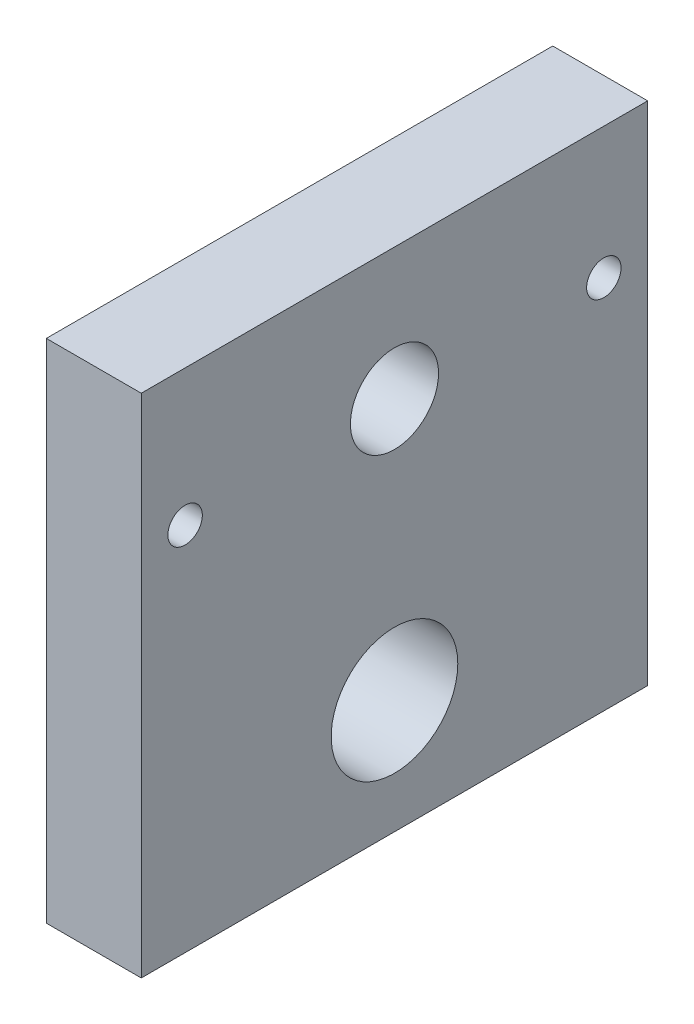
ISO-10303-21;
HEADER;
FILE_DESCRIPTION(('STEP AP214'),'2;1');
FILE_NAME('part.step','',(''),(''),'','','');
FILE_SCHEMA(('AUTOMOTIVE_DESIGN { 1 0 10303 214 1 1 1 1 }'));
ENDSEC;
DATA;
#1=APPLICATION_CONTEXT('core data for automotive mechanical design processes');
#2=APPLICATION_PROTOCOL_DEFINITION('international standard','automotive_design',2000,#1);
#3=PRODUCT_CONTEXT('',#1,'mechanical');
#4=PRODUCT('Part','Part','',(#3));
#5=PRODUCT_RELATED_PRODUCT_CATEGORY('part','',(#4));
#6=PRODUCT_DEFINITION_FORMATION('','',#4);
#7=PRODUCT_DEFINITION_CONTEXT('part definition',#1,'design');
#8=PRODUCT_DEFINITION('design','',#6,#7);
#9=PRODUCT_DEFINITION_SHAPE('','',#8);
#10=(LENGTH_UNIT() NAMED_UNIT(*) SI_UNIT(.MILLI.,.METRE.));
#11=(NAMED_UNIT(*) PLANE_ANGLE_UNIT() SI_UNIT($,.RADIAN.));
#12=(NAMED_UNIT(*) SI_UNIT($,.STERADIAN.) SOLID_ANGLE_UNIT());
#13=UNCERTAINTY_MEASURE_WITH_UNIT(LENGTH_MEASURE(1.E-05),#10,'distance_accuracy_value','');
#14=(GEOMETRIC_REPRESENTATION_CONTEXT(3) GLOBAL_UNCERTAINTY_ASSIGNED_CONTEXT((#13)) GLOBAL_UNIT_ASSIGNED_CONTEXT((#10,
#11,#12)) REPRESENTATION_CONTEXT('',''));
#15=CARTESIAN_POINT('',(0.,0.,0.));
#16=DIRECTION('',(0.,0.,1.));
#17=DIRECTION('',(1.,0.,0.));
#18=AXIS2_PLACEMENT_3D('',#15,#16,#17);
#19=CARTESIAN_POINT('',(9.525,-25.4,-25.4));
#20=DIRECTION('',(0.,0.,1.));
#21=DIRECTION('',(1.,0.,0.));
#22=AXIS2_PLACEMENT_3D('',#19,#20,#21);
#23=PLANE('',#22);
#24=CARTESIAN_POINT('',(4.7625,-19.05,-25.4));
#25=DIRECTION('',(0.,0.,-1.));
#26=DIRECTION('',(-1.,0.,0.));
#27=AXIS2_PLACEMENT_3D('',#24,#25,#26);
#28=CIRCLE('',#27,2.0193);
#29=CARTESIAN_POINT('',(2.7432,-19.05,-25.4));
#30=VERTEX_POINT('',#29);
#31=EDGE_CURVE('E103',#30,#30,#28,.T.);
#32=ORIENTED_EDGE('',*,*,#31,.F.);
#33=EDGE_LOOP('',(#32));
#34=FACE_BOUND('',#33,.T.);
#35=CARTESIAN_POINT('',(4.7625,19.05,-25.4));
#36=DIRECTION('',(0.,0.,-1.));
#37=DIRECTION('',(-1.,0.,0.));
#38=AXIS2_PLACEMENT_3D('',#35,#36,#37);
#39=CIRCLE('',#38,2.0193);
#40=CARTESIAN_POINT('',(2.7432,19.05,-25.4));
#41=VERTEX_POINT('',#40);
#42=EDGE_CURVE('E102',#41,#41,#39,.T.);
#43=ORIENTED_EDGE('',*,*,#42,.F.);
#44=EDGE_LOOP('',(#43));
#45=FACE_BOUND('',#44,.T.);
#46=DIRECTION('',(0.,1.,0.));
#47=VECTOR('',#46,1.);
#48=CARTESIAN_POINT('',(0.,-25.4,-25.4));
#49=LINE('',#48,#47);
#50=CARTESIAN_POINT('',(0.,-25.4,-25.4));
#51=VERTEX_POINT('',#50);
#52=CARTESIAN_POINT('',(0.,25.4,-25.4));
#53=VERTEX_POINT('',#52);
#54=EDGE_CURVE('E134',#51,#53,#49,.T.);
#55=ORIENTED_EDGE('',*,*,#54,.T.);
#56=DIRECTION('',(-1.,0.,0.));
#57=VECTOR('',#56,1.);
#58=CARTESIAN_POINT('',(9.525,25.4,-25.4));
#59=LINE('',#58,#57);
#60=CARTESIAN_POINT('',(9.525,25.4,-25.4));
#61=VERTEX_POINT('',#60);
#62=EDGE_CURVE('E11',#61,#53,#59,.T.);
#63=ORIENTED_EDGE('',*,*,#62,.F.);
#64=DIRECTION('',(0.,1.,0.));
#65=VECTOR('',#64,1.);
#66=CARTESIAN_POINT('',(9.525,-25.4,-25.4));
#67=LINE('',#66,#65);
#68=CARTESIAN_POINT('',(9.525,-25.4,-25.4));
#69=VERTEX_POINT('',#68);
#70=EDGE_CURVE('E135',#69,#61,#67,.T.);
#71=ORIENTED_EDGE('',*,*,#70,.F.);
#72=DIRECTION('',(-1.,0.,0.));
#73=VECTOR('',#72,1.);
#74=CARTESIAN_POINT('',(9.525,-25.4,-25.4));
#75=LINE('',#74,#73);
#76=EDGE_CURVE('E141',#69,#51,#75,.T.);
#77=ORIENTED_EDGE('',*,*,#76,.T.);
#78=EDGE_LOOP('',(#55,#63,#71,#77));
#79=FACE_BOUND('',#78,.T.);
#80=ADVANCED_FACE('F37',(#34,#45,#79),#23,.F.);
#81=CARTESIAN_POINT('',(9.525,25.4,25.4));
#82=DIRECTION('',(0.,-1.,0.));
#83=DIRECTION('',(0.,0.,-1.));
#84=AXIS2_PLACEMENT_3D('',#81,#82,#83);
#85=PLANE('',#84);
#86=DIRECTION('',(0.,0.,1.));
#87=VECTOR('',#86,1.);
#88=CARTESIAN_POINT('',(0.,25.4,25.4));
#89=LINE('',#88,#87);
#90=CARTESIAN_POINT('',(0.,25.4,25.4));
#91=VERTEX_POINT('',#90);
#92=EDGE_CURVE('E144',#53,#91,#89,.T.);
#93=ORIENTED_EDGE('',*,*,#92,.T.);
#94=DIRECTION('',(-1.,0.,0.));
#95=VECTOR('',#94,1.);
#96=CARTESIAN_POINT('',(9.525,25.4,25.4));
#97=LINE('',#96,#95);
#98=CARTESIAN_POINT('',(9.525,25.4,25.4));
#99=VERTEX_POINT('',#98);
#100=EDGE_CURVE('E46',#99,#91,#97,.T.);
#101=ORIENTED_EDGE('',*,*,#100,.F.);
#102=DIRECTION('',(0.,0.,1.));
#103=VECTOR('',#102,1.);
#104=CARTESIAN_POINT('',(9.525,25.4,25.4));
#105=LINE('',#104,#103);
#106=EDGE_CURVE('E85',#61,#99,#105,.T.);
#107=ORIENTED_EDGE('',*,*,#106,.F.);
#108=ORIENTED_EDGE('',*,*,#62,.T.);
#109=EDGE_LOOP('',(#93,#101,#107,#108));
#110=FACE_BOUND('',#109,.T.);
#111=ADVANCED_FACE('F169',(#110),#85,.F.);
#112=CARTESIAN_POINT('',(9.525,-25.4,25.4));
#113=DIRECTION('',(0.,0.,-1.));
#114=DIRECTION('',(-1.,0.,0.));
#115=AXIS2_PLACEMENT_3D('',#112,#113,#114);
#116=PLANE('',#115);
#117=DIRECTION('',(0.,-1.,0.));
#118=VECTOR('',#117,1.);
#119=CARTESIAN_POINT('',(0.,-25.4,25.4));
#120=LINE('',#119,#118);
#121=CARTESIAN_POINT('',(0.,-25.4,25.4));
#122=VERTEX_POINT('',#121);
#123=EDGE_CURVE('E72',#91,#122,#120,.T.);
#124=ORIENTED_EDGE('',*,*,#123,.T.);
#125=DIRECTION('',(-1.,0.,0.));
#126=VECTOR('',#125,1.);
#127=CARTESIAN_POINT('',(9.525,-25.4,25.4));
#128=LINE('',#127,#126);
#129=CARTESIAN_POINT('',(9.525,-25.4,25.4));
#130=VERTEX_POINT('',#129);
#131=EDGE_CURVE('E149',#130,#122,#128,.T.);
#132=ORIENTED_EDGE('',*,*,#131,.F.);
#133=DIRECTION('',(0.,-1.,0.));
#134=VECTOR('',#133,1.);
#135=CARTESIAN_POINT('',(9.525,-25.4,25.4));
#136=LINE('',#135,#134);
#137=EDGE_CURVE('E138',#99,#130,#136,.T.);
#138=ORIENTED_EDGE('',*,*,#137,.F.);
#139=ORIENTED_EDGE('',*,*,#100,.T.);
#140=EDGE_LOOP('',(#124,#132,#138,#139));
#141=FACE_BOUND('',#140,.T.);
#142=ADVANCED_FACE('F152',(#141),#116,.F.);
#143=CARTESIAN_POINT('',(9.525,-25.4,25.4));
#144=DIRECTION('',(0.,1.,0.));
#145=DIRECTION('',(0.,0.,1.));
#146=AXIS2_PLACEMENT_3D('',#143,#144,#145);
#147=PLANE('',#146);
#148=DIRECTION('',(0.,0.,-1.));
#149=VECTOR('',#148,1.);
#150=CARTESIAN_POINT('',(0.,-25.4,25.4));
#151=LINE('',#150,#149);
#152=EDGE_CURVE('E78',#122,#51,#151,.T.);
#153=ORIENTED_EDGE('',*,*,#152,.T.);
#154=ORIENTED_EDGE('',*,*,#76,.F.);
#155=DIRECTION('',(0.,0.,-1.));
#156=VECTOR('',#155,1.);
#157=CARTESIAN_POINT('',(9.525,-25.4,25.4));
#158=LINE('',#157,#156);
#159=EDGE_CURVE('E54',#130,#69,#158,.T.);
#160=ORIENTED_EDGE('',*,*,#159,.F.);
#161=ORIENTED_EDGE('',*,*,#131,.T.);
#162=EDGE_LOOP('',(#153,#154,#160,#161));
#163=FACE_BOUND('',#162,.T.);
#164=ADVANCED_FACE('F159',(#163),#147,.F.);
#165=CARTESIAN_POINT('',(9.525,0.,0.));
#166=DIRECTION('',(-1.,0.,0.));
#167=DIRECTION('',(0.,0.,1.));
#168=AXIS2_PLACEMENT_3D('',#165,#166,#167);
#169=PLANE('',#168);
#170=CARTESIAN_POINT('',(9.525,12.2301,-21.));
#171=DIRECTION('',(1.,0.,0.));
#172=DIRECTION('',(0.,0.,-1.));
#173=AXIS2_PLACEMENT_3D('',#170,#171,#172);
#174=CIRCLE('',#173,1.72719999999999);
#175=CARTESIAN_POINT('',(9.525,12.2301,-22.7272));
#176=VERTEX_POINT('',#175);
#177=EDGE_CURVE('E113',#176,#176,#174,.T.);
#178=ORIENTED_EDGE('',*,*,#177,.F.);
#179=EDGE_LOOP('',(#178));
#180=FACE_BOUND('',#179,.T.);
#181=CARTESIAN_POINT('',(9.525,11.7414591500542,21.));
#182=DIRECTION('',(1.,0.,0.));
#183=DIRECTION('',(0.,0.,-1.));
#184=AXIS2_PLACEMENT_3D('',#181,#182,#183);
#185=CIRCLE('',#184,1.72719999999999);
#186=CARTESIAN_POINT('',(9.525,11.7414591500542,19.2728));
#187=VERTEX_POINT('',#186);
#188=EDGE_CURVE('E116',#187,#187,#185,.T.);
#189=ORIENTED_EDGE('',*,*,#188,.F.);
#190=EDGE_LOOP('',(#189));
#191=FACE_BOUND('',#190,.T.);
#192=CARTESIAN_POINT('',(9.525,12.2301,0.));
#193=DIRECTION('',(1.,0.,0.));
#194=DIRECTION('',(0.,0.,-1.));
#195=AXIS2_PLACEMENT_3D('',#192,#193,#194);
#196=CIRCLE('',#195,4.41959999999999);
#197=CARTESIAN_POINT('',(9.525,12.2301,-4.41959999999999));
#198=VERTEX_POINT('',#197);
#199=EDGE_CURVE('E122',#198,#198,#196,.T.);
#200=ORIENTED_EDGE('',*,*,#199,.F.);
#201=EDGE_LOOP('',(#200));
#202=FACE_BOUND('',#201,.T.);
#203=CARTESIAN_POINT('',(9.525,-13.97,0.));
#204=DIRECTION('',(1.,0.,0.));
#205=DIRECTION('',(0.,0.,-1.));
#206=AXIS2_PLACEMENT_3D('',#203,#204,#205);
#207=CIRCLE('',#206,6.34999999999999);
#208=CARTESIAN_POINT('',(9.525,-13.97,-6.34999999999999));
#209=VERTEX_POINT('',#208);
#210=EDGE_CURVE('E128',#209,#209,#207,.T.);
#211=ORIENTED_EDGE('',*,*,#210,.F.);
#212=EDGE_LOOP('',(#211));
#213=FACE_BOUND('',#212,.T.);
#214=ORIENTED_EDGE('',*,*,#70,.T.);
#215=ORIENTED_EDGE('',*,*,#106,.T.);
#216=ORIENTED_EDGE('',*,*,#137,.T.);
#217=ORIENTED_EDGE('',*,*,#159,.T.);
#218=EDGE_LOOP('',(#214,#215,#216,#217));
#219=FACE_BOUND('',#218,.T.);
#220=ADVANCED_FACE('F161',(#180,#191,#202,#213,#219),#169,.F.);
#221=CARTESIAN_POINT('',(0.,0.,0.));
#222=DIRECTION('',(-1.,0.,0.));
#223=DIRECTION('',(0.,0.,1.));
#224=AXIS2_PLACEMENT_3D('',#221,#222,#223);
#225=PLANE('',#224);
#226=CARTESIAN_POINT('',(0.,12.2301,-21.));
#227=DIRECTION('',(-1.,0.,0.));
#228=DIRECTION('',(0.,0.,1.));
#229=AXIS2_PLACEMENT_3D('',#226,#227,#228);
#230=CIRCLE('',#229,1.72719999999999);
#231=CARTESIAN_POINT('',(0.,12.2301,-19.2728));
#232=VERTEX_POINT('',#231);
#233=EDGE_CURVE('E40',#232,#232,#230,.T.);
#234=ORIENTED_EDGE('',*,*,#233,.F.);
#235=EDGE_LOOP('',(#234));
#236=FACE_BOUND('',#235,.T.);
#237=CARTESIAN_POINT('',(0.,11.7414591500542,21.));
#238=DIRECTION('',(-1.,0.,0.));
#239=DIRECTION('',(0.,0.,1.));
#240=AXIS2_PLACEMENT_3D('',#237,#238,#239);
#241=CIRCLE('',#240,1.72719999999999);
#242=CARTESIAN_POINT('',(0.,11.7414591500542,22.7272));
#243=VERTEX_POINT('',#242);
#244=EDGE_CURVE('E119',#243,#243,#241,.T.);
#245=ORIENTED_EDGE('',*,*,#244,.F.);
#246=EDGE_LOOP('',(#245));
#247=FACE_BOUND('',#246,.T.);
#248=CARTESIAN_POINT('',(0.,12.2301,0.));
#249=DIRECTION('',(-1.,0.,0.));
#250=DIRECTION('',(0.,0.,1.));
#251=AXIS2_PLACEMENT_3D('',#248,#249,#250);
#252=CIRCLE('',#251,4.41959999999999);
#253=CARTESIAN_POINT('',(0.,12.2301,4.41959999999999));
#254=VERTEX_POINT('',#253);
#255=EDGE_CURVE('E125',#254,#254,#252,.T.);
#256=ORIENTED_EDGE('',*,*,#255,.F.);
#257=EDGE_LOOP('',(#256));
#258=FACE_BOUND('',#257,.T.);
#259=CARTESIAN_POINT('',(0.,-13.97,0.));
#260=DIRECTION('',(-1.,0.,0.));
#261=DIRECTION('',(0.,0.,1.));
#262=AXIS2_PLACEMENT_3D('',#259,#260,#261);
#263=CIRCLE('',#262,6.34999999999999);
#264=CARTESIAN_POINT('',(0.,-13.97,6.34999999999998));
#265=VERTEX_POINT('',#264);
#266=EDGE_CURVE('E131',#265,#265,#263,.T.);
#267=ORIENTED_EDGE('',*,*,#266,.F.);
#268=EDGE_LOOP('',(#267));
#269=FACE_BOUND('',#268,.T.);
#270=ORIENTED_EDGE('',*,*,#54,.F.);
#271=ORIENTED_EDGE('',*,*,#152,.F.);
#272=ORIENTED_EDGE('',*,*,#123,.F.);
#273=ORIENTED_EDGE('',*,*,#92,.F.);
#274=EDGE_LOOP('',(#270,#271,#272,#273));
#275=FACE_BOUND('',#274,.T.);
#276=ADVANCED_FACE('F155',(#236,#247,#258,#269,#275),#225,.T.);
#277=CARTESIAN_POINT('',(9.525,-13.97,0.));
#278=DIRECTION('',(1.,0.,0.));
#279=DIRECTION('',(0.,0.,-1.));
#280=AXIS2_PLACEMENT_3D('',#277,#278,#279);
#281=CYLINDRICAL_SURFACE('',#280,6.34999999999999);
#282=ORIENTED_EDGE('',*,*,#266,.T.);
#283=EDGE_LOOP('',(#282));
#284=FACE_BOUND('',#283,.T.);
#285=ORIENTED_EDGE('',*,*,#210,.T.);
#286=EDGE_LOOP('',(#285));
#287=FACE_BOUND('',#286,.T.);
#288=ADVANCED_FACE('F204',(#284,#287),#281,.F.);
#289=CARTESIAN_POINT('',(9.525,12.2301,0.));
#290=DIRECTION('',(1.,0.,0.));
#291=DIRECTION('',(0.,0.,-1.));
#292=AXIS2_PLACEMENT_3D('',#289,#290,#291);
#293=CYLINDRICAL_SURFACE('',#292,4.41959999999999);
#294=ORIENTED_EDGE('',*,*,#255,.T.);
#295=EDGE_LOOP('',(#294));
#296=FACE_BOUND('',#295,.T.);
#297=ORIENTED_EDGE('',*,*,#199,.T.);
#298=EDGE_LOOP('',(#297));
#299=FACE_BOUND('',#298,.T.);
#300=ADVANCED_FACE('F200',(#296,#299),#293,.F.);
#301=CARTESIAN_POINT('',(9.525,11.7414591500542,21.));
#302=DIRECTION('',(1.,0.,0.));
#303=DIRECTION('',(0.,0.,-1.));
#304=AXIS2_PLACEMENT_3D('',#301,#302,#303);
#305=CYLINDRICAL_SURFACE('',#304,1.72719999999999);
#306=ORIENTED_EDGE('',*,*,#244,.T.);
#307=EDGE_LOOP('',(#306));
#308=FACE_BOUND('',#307,.T.);
#309=ORIENTED_EDGE('',*,*,#188,.T.);
#310=EDGE_LOOP('',(#309));
#311=FACE_BOUND('',#310,.T.);
#312=ADVANCED_FACE('F196',(#308,#311),#305,.F.);
#313=CARTESIAN_POINT('',(9.525,12.2301,-21.));
#314=DIRECTION('',(1.,0.,0.));
#315=DIRECTION('',(0.,0.,-1.));
#316=AXIS2_PLACEMENT_3D('',#313,#314,#315);
#317=CYLINDRICAL_SURFACE('',#316,1.72719999999999);
#318=ORIENTED_EDGE('',*,*,#233,.T.);
#319=EDGE_LOOP('',(#318));
#320=FACE_BOUND('',#319,.T.);
#321=ORIENTED_EDGE('',*,*,#177,.T.);
#322=EDGE_LOOP('',(#321));
#323=FACE_BOUND('',#322,.T.);
#324=ADVANCED_FACE('F188',(#320,#323),#317,.F.);
#325=CARTESIAN_POINT('',(4.7625,19.05,-13.462));
#326=DIRECTION('',(0.,0.,-1.));
#327=DIRECTION('',(-1.,0.,0.));
#328=AXIS2_PLACEMENT_3D('',#325,#326,#327);
#329=CONICAL_SURFACE('',#328,2.0193,1.02974425867665);
#330=CARTESIAN_POINT('',(4.7625,19.05,-12.2486821519976));
#331=VERTEX_POINT('',#330);
#332=VERTEX_LOOP('',#331);
#333=FACE_BOUND('',#332,.T.);
#334=CARTESIAN_POINT('',(4.7625,19.05,-13.462));
#335=DIRECTION('',(0.,0.,-1.));
#336=DIRECTION('',(-1.,0.,0.));
#337=AXIS2_PLACEMENT_3D('',#334,#335,#336);
#338=CIRCLE('',#337,2.0193);
#339=CARTESIAN_POINT('',(2.74320000000001,19.05,-13.462));
#340=VERTEX_POINT('',#339);
#341=EDGE_CURVE('E106',#340,#340,#338,.T.);
#342=ORIENTED_EDGE('',*,*,#341,.T.);
#343=EDGE_LOOP('',(#342));
#344=FACE_BOUND('',#343,.T.);
#345=ADVANCED_FACE('F182',(#333,#344),#329,.F.);
#346=CARTESIAN_POINT('',(4.7625,19.05,-25.4));
#347=DIRECTION('',(0.,0.,-1.));
#348=DIRECTION('',(-1.,0.,0.));
#349=AXIS2_PLACEMENT_3D('',#346,#347,#348);
#350=CYLINDRICAL_SURFACE('',#349,2.0193);
#351=ORIENTED_EDGE('',*,*,#341,.F.);
#352=EDGE_LOOP('',(#351));
#353=FACE_BOUND('',#352,.T.);
#354=ORIENTED_EDGE('',*,*,#42,.T.);
#355=EDGE_LOOP('',(#354));
#356=FACE_BOUND('',#355,.T.);
#357=ADVANCED_FACE('F96',(#353,#356),#350,.F.);
#358=CARTESIAN_POINT('',(4.7625,-19.05,-13.462));
#359=DIRECTION('',(0.,0.,-1.));
#360=DIRECTION('',(-1.,0.,0.));
#361=AXIS2_PLACEMENT_3D('',#358,#359,#360);
#362=CONICAL_SURFACE('',#361,2.0193,1.02974425867665);
#363=CARTESIAN_POINT('',(4.7625,-19.05,-12.2486821519976));
#364=VERTEX_POINT('',#363);
#365=VERTEX_LOOP('',#364);
#366=FACE_BOUND('',#365,.T.);
#367=CARTESIAN_POINT('',(4.7625,-19.05,-13.462));
#368=DIRECTION('',(0.,0.,-1.));
#369=DIRECTION('',(-1.,0.,0.));
#370=AXIS2_PLACEMENT_3D('',#367,#368,#369);
#371=CIRCLE('',#370,2.0193);
#372=CARTESIAN_POINT('',(2.74320000000001,-19.05,-13.462));
#373=VERTEX_POINT('',#372);
#374=EDGE_CURVE('E100',#373,#373,#371,.T.);
#375=ORIENTED_EDGE('',*,*,#374,.T.);
#376=EDGE_LOOP('',(#375));
#377=FACE_BOUND('',#376,.T.);
#378=ADVANCED_FACE('F92',(#366,#377),#362,.F.);
#379=CARTESIAN_POINT('',(4.7625,-19.05,-25.4));
#380=DIRECTION('',(0.,0.,-1.));
#381=DIRECTION('',(-1.,0.,0.));
#382=AXIS2_PLACEMENT_3D('',#379,#380,#381);
#383=CYLINDRICAL_SURFACE('',#382,2.0193);
#384=ORIENTED_EDGE('',*,*,#374,.F.);
#385=EDGE_LOOP('',(#384));
#386=FACE_BOUND('',#385,.T.);
#387=ORIENTED_EDGE('',*,*,#31,.T.);
#388=EDGE_LOOP('',(#387));
#389=FACE_BOUND('',#388,.T.);
#390=ADVANCED_FACE('F95',(#386,#389),#383,.F.);
#391=CLOSED_SHELL('',(#80,#111,#142,#164,#220,#276,#288,#300,#312,#324,#345,#357,#378,#390));
#392=MANIFOLD_SOLID_BREP('B2',#391);
#393=ADVANCED_BREP_SHAPE_REPRESENTATION('',(#18,#392),#14);
#394=SHAPE_DEFINITION_REPRESENTATION(#9,#393);
ENDSEC;
END-ISO-10303-21;
